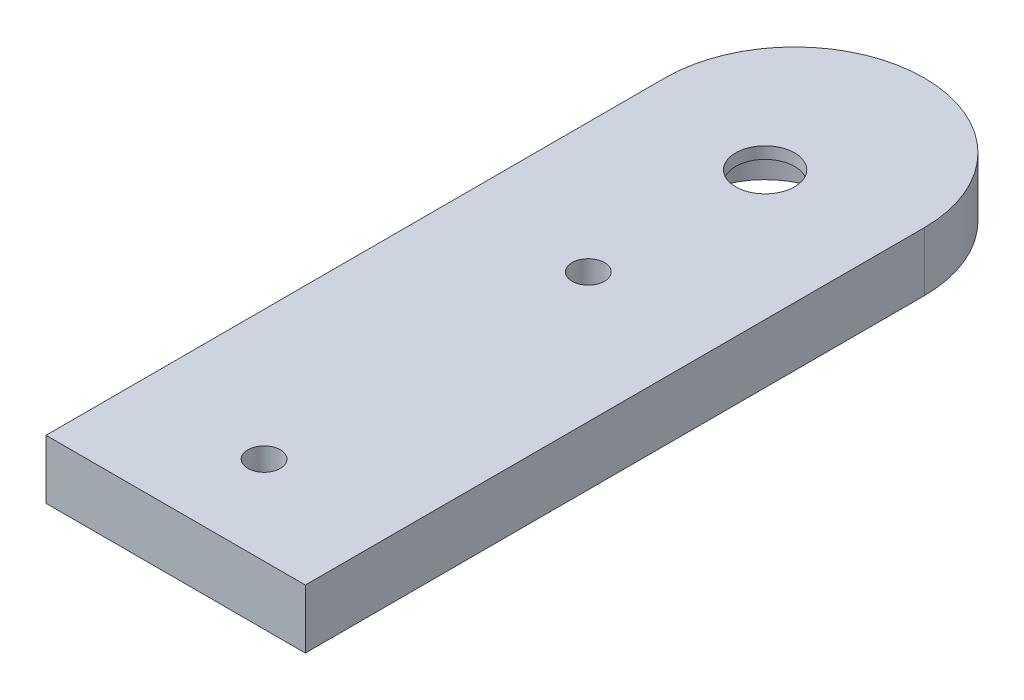
ISO-10303-21;
HEADER;
FILE_DESCRIPTION(('STEP AP214'),'2;1');
FILE_NAME('part.step','',(''),(''),'','','');
FILE_SCHEMA(('AUTOMOTIVE_DESIGN { 1 0 10303 214 1 1 1 1 }'));
ENDSEC;
DATA;
#1=APPLICATION_CONTEXT('core data for automotive mechanical design processes');
#2=APPLICATION_PROTOCOL_DEFINITION('international standard','automotive_design',2000,#1);
#3=PRODUCT_CONTEXT('',#1,'mechanical');
#4=PRODUCT('Part','Part','',(#3));
#5=PRODUCT_RELATED_PRODUCT_CATEGORY('part','',(#4));
#6=PRODUCT_DEFINITION_FORMATION('','',#4);
#7=PRODUCT_DEFINITION_CONTEXT('part definition',#1,'design');
#8=PRODUCT_DEFINITION('design','',#6,#7);
#9=PRODUCT_DEFINITION_SHAPE('','',#8);
#10=(LENGTH_UNIT() NAMED_UNIT(*) SI_UNIT(.MILLI.,.METRE.));
#11=(NAMED_UNIT(*) PLANE_ANGLE_UNIT() SI_UNIT($,.RADIAN.));
#12=(NAMED_UNIT(*) SI_UNIT($,.STERADIAN.) SOLID_ANGLE_UNIT());
#13=UNCERTAINTY_MEASURE_WITH_UNIT(LENGTH_MEASURE(1.E-05),#10,'distance_accuracy_value','');
#14=(GEOMETRIC_REPRESENTATION_CONTEXT(3) GLOBAL_UNCERTAINTY_ASSIGNED_CONTEXT((#13)) GLOBAL_UNIT_ASSIGNED_CONTEXT((#10,
#11,#12)) REPRESENTATION_CONTEXT('',''));
#15=CARTESIAN_POINT('',(0.,0.,0.));
#16=DIRECTION('',(0.,0.,1.));
#17=DIRECTION('',(1.,0.,0.));
#18=AXIS2_PLACEMENT_3D('',#15,#16,#17);
#19=CARTESIAN_POINT('',(0.,0.,-63.5));
#20=DIRECTION('',(0.,-1.,0.));
#21=DIRECTION('',(0.,0.,-1.));
#22=AXIS2_PLACEMENT_3D('',#19,#20,#21);
#23=PLANE('',#22);
#24=CARTESIAN_POINT('',(0.,0.,-58.5));
#25=DIRECTION('',(0.,1.,0.));
#26=DIRECTION('',(0.,0.,1.));
#27=AXIS2_PLACEMENT_3D('',#24,#25,#26);
#28=CIRCLE('',#27,12.1);
#29=CARTESIAN_POINT('',(0.,0.,-46.4));
#30=VERTEX_POINT('',#29);
#31=EDGE_CURVE('E109',#30,#30,#28,.T.);
#32=ORIENTED_EDGE('',*,*,#31,.T.);
#33=EDGE_LOOP('',(#32));
#34=FACE_BOUND('',#33,.T.);
#35=CARTESIAN_POINT('',(0.,0.,-63.5));
#36=DIRECTION('',(0.,1.,0.));
#37=DIRECTION('',(0.,0.,-1.));
#38=AXIS2_PLACEMENT_3D('',#35,#36,#37);
#39=CIRCLE('',#38,22.);
#40=CARTESIAN_POINT('',(22.,0.,-63.5));
#41=VERTEX_POINT('',#40);
#42=CARTESIAN_POINT('',(-22.,0.,-63.5));
#43=VERTEX_POINT('',#42);
#44=EDGE_CURVE('E117',#41,#43,#39,.T.);
#45=ORIENTED_EDGE('',*,*,#44,.F.);
#46=DIRECTION('',(0.,0.,-1.));
#47=VECTOR('',#46,1.);
#48=CARTESIAN_POINT('',(22.,0.,41.5));
#49=LINE('',#48,#47);
#50=CARTESIAN_POINT('',(22.,0.,41.5));
#51=VERTEX_POINT('',#50);
#52=EDGE_CURVE('E122',#51,#41,#49,.T.);
#53=ORIENTED_EDGE('',*,*,#52,.F.);
#54=DIRECTION('',(1.,0.,0.));
#55=VECTOR('',#54,1.);
#56=CARTESIAN_POINT('',(-22.,0.,41.5));
#57=LINE('',#56,#55);
#58=CARTESIAN_POINT('',(-22.,0.,41.5));
#59=VERTEX_POINT('',#58);
#60=EDGE_CURVE('E52',#59,#51,#57,.T.);
#61=ORIENTED_EDGE('',*,*,#60,.F.);
#62=DIRECTION('',(0.,0.,1.));
#63=VECTOR('',#62,1.);
#64=CARTESIAN_POINT('',(-22.,0.,41.5));
#65=LINE('',#64,#63);
#66=EDGE_CURVE('E60',#43,#59,#65,.T.);
#67=ORIENTED_EDGE('',*,*,#66,.F.);
#68=EDGE_LOOP('',(#45,#53,#61,#67));
#69=FACE_BOUND('',#68,.T.);
#70=CARTESIAN_POINT('',(0.,0.,26.5));
#71=DIRECTION('',(0.,1.,0.));
#72=DIRECTION('',(0.,0.,1.));
#73=AXIS2_PLACEMENT_3D('',#70,#71,#72);
#74=CIRCLE('',#73,2.75);
#75=CARTESIAN_POINT('',(0.,0.,29.25));
#76=VERTEX_POINT('',#75);
#77=EDGE_CURVE('E114',#76,#76,#74,.T.);
#78=ORIENTED_EDGE('',*,*,#77,.T.);
#79=EDGE_LOOP('',(#78));
#80=FACE_BOUND('',#79,.T.);
#81=CARTESIAN_POINT('',(0.,0.,-28.5));
#82=DIRECTION('',(0.,1.,0.));
#83=DIRECTION('',(0.,0.,1.));
#84=AXIS2_PLACEMENT_3D('',#81,#82,#83);
#85=CIRCLE('',#84,2.75);
#86=CARTESIAN_POINT('',(0.,0.,-25.75));
#87=VERTEX_POINT('',#86);
#88=EDGE_CURVE('E106',#87,#87,#85,.T.);
#89=ORIENTED_EDGE('',*,*,#88,.T.);
#90=EDGE_LOOP('',(#89));
#91=FACE_BOUND('',#90,.T.);
#92=ADVANCED_FACE('F37',(#34,#69,#80,#91),#23,.T.);
#93=CARTESIAN_POINT('',(0.,8.,-63.5));
#94=DIRECTION('',(0.,-1.,0.));
#95=DIRECTION('',(0.,0.,-1.));
#96=AXIS2_PLACEMENT_3D('',#93,#94,#95);
#97=CYLINDRICAL_SURFACE('',#96,22.);
#98=ORIENTED_EDGE('',*,*,#44,.T.);
#99=DIRECTION('',(0.,-1.,0.));
#100=VECTOR('',#99,1.);
#101=CARTESIAN_POINT('',(-22.,8.,-63.5));
#102=LINE('',#101,#100);
#103=CARTESIAN_POINT('',(-22.,10.,-63.5));
#104=VERTEX_POINT('',#103);
#105=EDGE_CURVE('E45',#104,#43,#102,.T.);
#106=ORIENTED_EDGE('',*,*,#105,.F.);
#107=CARTESIAN_POINT('',(0.,10.,-63.5));
#108=DIRECTION('',(0.,1.,0.));
#109=DIRECTION('',(0.,0.,-1.));
#110=AXIS2_PLACEMENT_3D('',#107,#108,#109);
#111=CIRCLE('',#110,22.);
#112=CARTESIAN_POINT('',(22.,10.,-63.5));
#113=VERTEX_POINT('',#112);
#114=EDGE_CURVE('E95',#113,#104,#111,.T.);
#115=ORIENTED_EDGE('',*,*,#114,.F.);
#116=DIRECTION('',(0.,-1.,0.));
#117=VECTOR('',#116,1.);
#118=CARTESIAN_POINT('',(22.,8.,-63.5));
#119=LINE('',#118,#117);
#120=EDGE_CURVE('E11',#113,#41,#119,.T.);
#121=ORIENTED_EDGE('',*,*,#120,.T.);
#122=EDGE_LOOP('',(#98,#106,#115,#121));
#123=FACE_BOUND('',#122,.T.);
#124=ADVANCED_FACE('F39',(#123),#97,.T.);
#125=CARTESIAN_POINT('',(-22.,8.,41.5));
#126=DIRECTION('',(1.,0.,0.));
#127=DIRECTION('',(0.,0.,-1.));
#128=AXIS2_PLACEMENT_3D('',#125,#126,#127);
#129=PLANE('',#128);
#130=ORIENTED_EDGE('',*,*,#66,.T.);
#131=DIRECTION('',(0.,-1.,0.));
#132=VECTOR('',#131,1.);
#133=CARTESIAN_POINT('',(-22.,8.,41.5));
#134=LINE('',#133,#132);
#135=CARTESIAN_POINT('',(-22.,10.,41.5));
#136=VERTEX_POINT('',#135);
#137=EDGE_CURVE('E76',#136,#59,#134,.T.);
#138=ORIENTED_EDGE('',*,*,#137,.F.);
#139=DIRECTION('',(0.,0.,1.));
#140=VECTOR('',#139,1.);
#141=CARTESIAN_POINT('',(-22.,10.,-63.5));
#142=LINE('',#141,#140);
#143=EDGE_CURVE('E80',#104,#136,#142,.T.);
#144=ORIENTED_EDGE('',*,*,#143,.F.);
#145=ORIENTED_EDGE('',*,*,#105,.T.);
#146=EDGE_LOOP('',(#130,#138,#144,#145));
#147=FACE_BOUND('',#146,.T.);
#148=ADVANCED_FACE('F78',(#147),#129,.F.);
#149=CARTESIAN_POINT('',(-22.,8.,41.5));
#150=DIRECTION('',(0.,0.,-1.));
#151=DIRECTION('',(-1.,0.,0.));
#152=AXIS2_PLACEMENT_3D('',#149,#150,#151);
#153=PLANE('',#152);
#154=ORIENTED_EDGE('',*,*,#60,.T.);
#155=DIRECTION('',(0.,-1.,0.));
#156=VECTOR('',#155,1.);
#157=CARTESIAN_POINT('',(22.,8.,41.5));
#158=LINE('',#157,#156);
#159=CARTESIAN_POINT('',(22.,10.,41.5));
#160=VERTEX_POINT('',#159);
#161=EDGE_CURVE('E81',#160,#51,#158,.T.);
#162=ORIENTED_EDGE('',*,*,#161,.F.);
#163=DIRECTION('',(1.,0.,0.));
#164=VECTOR('',#163,1.);
#165=CARTESIAN_POINT('',(-22.,10.,41.5));
#166=LINE('',#165,#164);
#167=EDGE_CURVE('E84',#136,#160,#166,.T.);
#168=ORIENTED_EDGE('',*,*,#167,.F.);
#169=ORIENTED_EDGE('',*,*,#137,.T.);
#170=EDGE_LOOP('',(#154,#162,#168,#169));
#171=FACE_BOUND('',#170,.T.);
#172=ADVANCED_FACE('F85',(#171),#153,.F.);
#173=CARTESIAN_POINT('',(22.,8.,41.5));
#174=DIRECTION('',(-1.,0.,0.));
#175=DIRECTION('',(0.,0.,1.));
#176=AXIS2_PLACEMENT_3D('',#173,#174,#175);
#177=PLANE('',#176);
#178=ORIENTED_EDGE('',*,*,#52,.T.);
#179=ORIENTED_EDGE('',*,*,#120,.F.);
#180=DIRECTION('',(0.,0.,-1.));
#181=VECTOR('',#180,1.);
#182=CARTESIAN_POINT('',(22.,10.,41.5));
#183=LINE('',#182,#181);
#184=EDGE_CURVE('E89',#160,#113,#183,.T.);
#185=ORIENTED_EDGE('',*,*,#184,.F.);
#186=ORIENTED_EDGE('',*,*,#161,.T.);
#187=EDGE_LOOP('',(#178,#179,#185,#186));
#188=FACE_BOUND('',#187,.T.);
#189=ADVANCED_FACE('F130',(#188),#177,.F.);
#190=CARTESIAN_POINT('',(0.,8.,26.5));
#191=DIRECTION('',(0.,-1.,0.));
#192=DIRECTION('',(0.,0.,-1.));
#193=AXIS2_PLACEMENT_3D('',#190,#191,#192);
#194=CYLINDRICAL_SURFACE('',#193,2.75);
#195=ORIENTED_EDGE('',*,*,#77,.F.);
#196=EDGE_LOOP('',(#195));
#197=FACE_BOUND('',#196,.T.);
#198=CARTESIAN_POINT('',(0.,10.,26.5));
#199=DIRECTION('',(0.,1.,0.));
#200=DIRECTION('',(0.,0.,1.));
#201=AXIS2_PLACEMENT_3D('',#198,#199,#200);
#202=CIRCLE('',#201,2.75);
#203=CARTESIAN_POINT('',(0.,10.,29.25));
#204=VERTEX_POINT('',#203);
#205=EDGE_CURVE('E99',#204,#204,#202,.T.);
#206=ORIENTED_EDGE('',*,*,#205,.T.);
#207=EDGE_LOOP('',(#206));
#208=FACE_BOUND('',#207,.T.);
#209=ADVANCED_FACE('F132',(#197,#208),#194,.F.);
#210=CARTESIAN_POINT('',(0.,8.,-58.5));
#211=DIRECTION('',(0.,-1.,0.));
#212=DIRECTION('',(0.,0.,-1.));
#213=AXIS2_PLACEMENT_3D('',#210,#211,#212);
#214=CYLINDRICAL_SURFACE('',#213,12.1);
#215=CARTESIAN_POINT('',(0.,8.,-58.5));
#216=DIRECTION('',(0.,1.,0.));
#217=DIRECTION('',(0.,0.,1.));
#218=AXIS2_PLACEMENT_3D('',#215,#216,#217);
#219=CIRCLE('',#218,12.1);
#220=CARTESIAN_POINT('',(0.,8.,-46.4));
#221=VERTEX_POINT('',#220);
#222=EDGE_CURVE('E105',#221,#221,#219,.T.);
#223=ORIENTED_EDGE('',*,*,#222,.T.);
#224=EDGE_LOOP('',(#223));
#225=FACE_BOUND('',#224,.T.);
#226=ORIENTED_EDGE('',*,*,#31,.F.);
#227=EDGE_LOOP('',(#226));
#228=FACE_BOUND('',#227,.T.);
#229=ADVANCED_FACE('F138',(#225,#228),#214,.F.);
#230=CARTESIAN_POINT('',(0.,8.,-28.5));
#231=DIRECTION('',(0.,-1.,0.));
#232=DIRECTION('',(0.,0.,-1.));
#233=AXIS2_PLACEMENT_3D('',#230,#231,#232);
#234=CYLINDRICAL_SURFACE('',#233,2.75);
#235=ORIENTED_EDGE('',*,*,#88,.F.);
#236=EDGE_LOOP('',(#235));
#237=FACE_BOUND('',#236,.T.);
#238=CARTESIAN_POINT('',(0.,10.,-28.5));
#239=DIRECTION('',(0.,1.,0.));
#240=DIRECTION('',(0.,0.,1.));
#241=AXIS2_PLACEMENT_3D('',#238,#239,#240);
#242=CIRCLE('',#241,2.75);
#243=CARTESIAN_POINT('',(0.,10.,-25.75));
#244=VERTEX_POINT('',#243);
#245=EDGE_CURVE('E96',#244,#244,#242,.T.);
#246=ORIENTED_EDGE('',*,*,#245,.T.);
#247=EDGE_LOOP('',(#246));
#248=FACE_BOUND('',#247,.T.);
#249=ADVANCED_FACE('F151',(#237,#248),#234,.F.);
#250=CARTESIAN_POINT('',(0.,8.,-63.5));
#251=DIRECTION('',(0.,-1.,0.));
#252=DIRECTION('',(0.,0.,-1.));
#253=AXIS2_PLACEMENT_3D('',#250,#251,#252);
#254=PLANE('',#253);
#255=CARTESIAN_POINT('',(0.,8.,-58.5));
#256=DIRECTION('',(0.,1.,0.));
#257=DIRECTION('',(0.,0.,1.));
#258=AXIS2_PLACEMENT_3D('',#255,#256,#257);
#259=CIRCLE('',#258,5.);
#260=CARTESIAN_POINT('',(0.,8.,-53.5));
#261=VERTEX_POINT('',#260);
#262=EDGE_CURVE('E173',#261,#261,#259,.T.);
#263=ORIENTED_EDGE('',*,*,#262,.T.);
#264=EDGE_LOOP('',(#263));
#265=FACE_BOUND('',#264,.T.);
#266=ORIENTED_EDGE('',*,*,#222,.F.);
#267=EDGE_LOOP('',(#266));
#268=FACE_BOUND('',#267,.T.);
#269=ADVANCED_FACE('F155',(#265,#268),#254,.T.);
#270=CARTESIAN_POINT('',(0.,10.,-63.5));
#271=DIRECTION('',(0.,-1.,0.));
#272=DIRECTION('',(0.,0.,-1.));
#273=AXIS2_PLACEMENT_3D('',#270,#271,#272);
#274=PLANE('',#273);
#275=ORIENTED_EDGE('',*,*,#143,.T.);
#276=ORIENTED_EDGE('',*,*,#167,.T.);
#277=ORIENTED_EDGE('',*,*,#184,.T.);
#278=ORIENTED_EDGE('',*,*,#114,.T.);
#279=EDGE_LOOP('',(#275,#276,#277,#278));
#280=FACE_BOUND('',#279,.T.);
#281=ORIENTED_EDGE('',*,*,#245,.F.);
#282=EDGE_LOOP('',(#281));
#283=FACE_BOUND('',#282,.T.);
#284=ORIENTED_EDGE('',*,*,#205,.F.);
#285=EDGE_LOOP('',(#284));
#286=FACE_BOUND('',#285,.T.);
#287=CARTESIAN_POINT('',(0.,10.,-58.5));
#288=DIRECTION('',(0.,1.,0.));
#289=DIRECTION('',(0.,0.,1.));
#290=AXIS2_PLACEMENT_3D('',#287,#288,#289);
#291=CIRCLE('',#290,5.);
#292=CARTESIAN_POINT('',(0.,10.,-53.5));
#293=VERTEX_POINT('',#292);
#294=EDGE_CURVE('E170',#293,#293,#291,.T.);
#295=ORIENTED_EDGE('',*,*,#294,.F.);
#296=EDGE_LOOP('',(#295));
#297=FACE_BOUND('',#296,.T.);
#298=ADVANCED_FACE('F92',(#280,#283,#286,#297),#274,.F.);
#299=CARTESIAN_POINT('',(0.,10.,-58.5));
#300=DIRECTION('',(0.,-1.,0.));
#301=DIRECTION('',(0.,0.,-1.));
#302=AXIS2_PLACEMENT_3D('',#299,#300,#301);
#303=CYLINDRICAL_SURFACE('',#302,5.);
#304=ORIENTED_EDGE('',*,*,#294,.T.);
#305=EDGE_LOOP('',(#304));
#306=FACE_BOUND('',#305,.T.);
#307=ORIENTED_EDGE('',*,*,#262,.F.);
#308=EDGE_LOOP('',(#307));
#309=FACE_BOUND('',#308,.T.);
#310=ADVANCED_FACE('F162',(#306,#309),#303,.F.);
#311=CLOSED_SHELL('',(#92,#124,#148,#172,#189,#209,#229,#249,#269,#298,#310));
#312=MANIFOLD_SOLID_BREP('B2',#311);
#313=ADVANCED_BREP_SHAPE_REPRESENTATION('',(#18,#312),#14);
#314=SHAPE_DEFINITION_REPRESENTATION(#9,#313);
ENDSEC;
END-ISO-10303-21;
